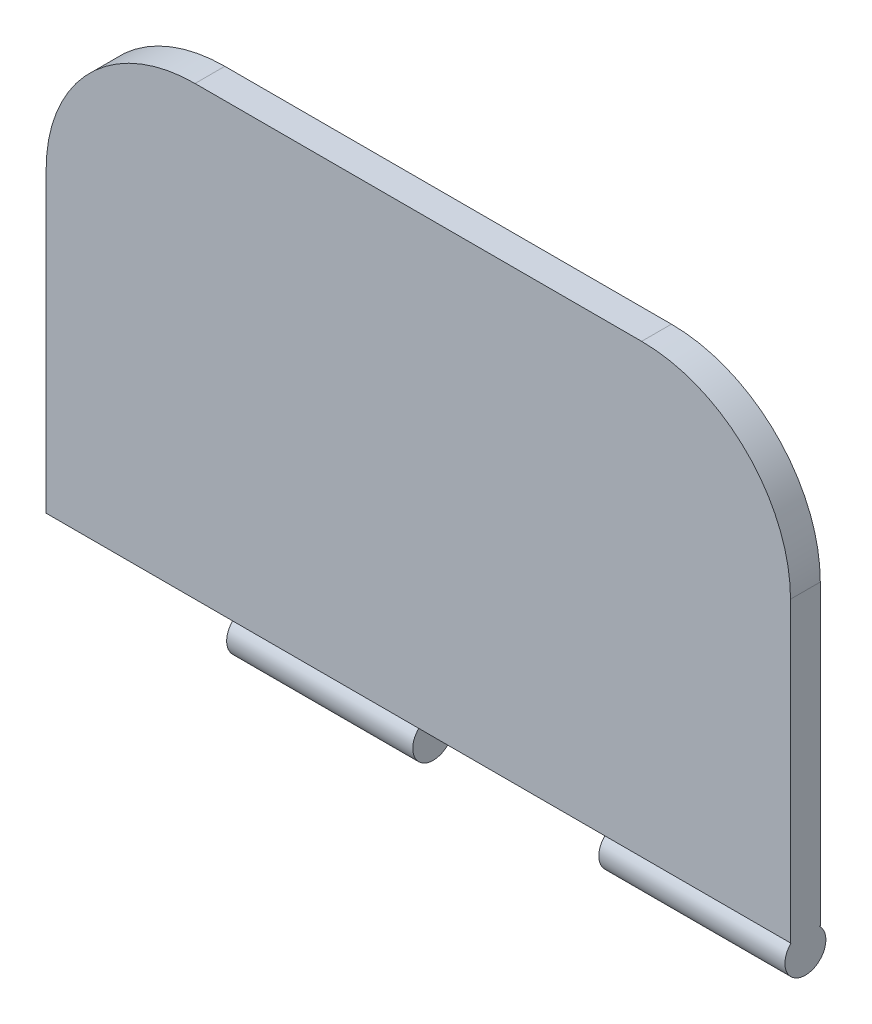
ISO-10303-21;
HEADER;
FILE_DESCRIPTION(('STEP AP214'),'2;1');
FILE_NAME('part.step','',(''),(''),'','','');
FILE_SCHEMA(('AUTOMOTIVE_DESIGN { 1 0 10303 214 1 1 1 1 }'));
ENDSEC;
DATA;
#1=APPLICATION_CONTEXT('core data for automotive mechanical design processes');
#2=APPLICATION_PROTOCOL_DEFINITION('international standard','automotive_design',2000,#1);
#3=PRODUCT_CONTEXT('',#1,'mechanical');
#4=PRODUCT('Part','Part','',(#3));
#5=PRODUCT_RELATED_PRODUCT_CATEGORY('part','',(#4));
#6=PRODUCT_DEFINITION_FORMATION('','',#4);
#7=PRODUCT_DEFINITION_CONTEXT('part definition',#1,'design');
#8=PRODUCT_DEFINITION('design','',#6,#7);
#9=PRODUCT_DEFINITION_SHAPE('','',#8);
#10=(LENGTH_UNIT() NAMED_UNIT(*) SI_UNIT(.MILLI.,.METRE.));
#11=(NAMED_UNIT(*) PLANE_ANGLE_UNIT() SI_UNIT($,.RADIAN.));
#12=(NAMED_UNIT(*) SI_UNIT($,.STERADIAN.) SOLID_ANGLE_UNIT());
#13=UNCERTAINTY_MEASURE_WITH_UNIT(LENGTH_MEASURE(1.E-05),#10,'distance_accuracy_value','');
#14=(GEOMETRIC_REPRESENTATION_CONTEXT(3) GLOBAL_UNCERTAINTY_ASSIGNED_CONTEXT((#13)) GLOBAL_UNIT_ASSIGNED_CONTEXT((#10,
#11,#12)) REPRESENTATION_CONTEXT('',''));
#15=CARTESIAN_POINT('',(0.,0.,0.));
#16=DIRECTION('',(0.,0.,1.));
#17=DIRECTION('',(1.,0.,0.));
#18=AXIS2_PLACEMENT_3D('',#15,#16,#17);
#19=CARTESIAN_POINT('',(-28.889087296526,-16.,1.));
#20=DIRECTION('',(1.,0.,0.));
#21=DIRECTION('',(0.,1.,0.));
#22=AXIS2_PLACEMENT_3D('',#19,#20,#21);
#23=CYLINDRICAL_SURFACE('',#22,1.375);
#24=CARTESIAN_POINT('',(0.,-16.,1.));
#25=DIRECTION('',(-1.,0.,0.));
#26=DIRECTION('',(0.,-1.,0.));
#27=AXIS2_PLACEMENT_3D('',#24,#25,#26);
#28=CIRCLE('',#27,1.375);
#29=CARTESIAN_POINT('',(0.,-15.,1.94372930440885));
#30=VERTEX_POINT('',#29);
#31=CARTESIAN_POINT('',(0.,-15.,0.0562706955911504));
#32=VERTEX_POINT('',#31);
#33=EDGE_CURVE('E126',#30,#32,#28,.T.);
#34=ORIENTED_EDGE('',*,*,#33,.T.);
#35=DIRECTION('',(1.,0.,0.));
#36=VECTOR('',#35,1.);
#37=CARTESIAN_POINT('',(-28.889087296526,-15.,0.0562706955911434));
#38=LINE('',#37,#36);
#39=CARTESIAN_POINT('',(12.5,-15.,0.0562706955911434));
#40=VERTEX_POINT('',#39);
#41=EDGE_CURVE('E199',#40,#32,#38,.F.);
#42=ORIENTED_EDGE('',*,*,#41,.F.);
#43=CARTESIAN_POINT('',(12.5,-16.,1.));
#44=DIRECTION('',(1.,0.,0.));
#45=DIRECTION('',(0.,1.,0.));
#46=AXIS2_PLACEMENT_3D('',#43,#44,#45);
#47=CIRCLE('',#46,1.375);
#48=CARTESIAN_POINT('',(12.5,-15.,1.94372930440886));
#49=VERTEX_POINT('',#48);
#50=EDGE_CURVE('E11',#49,#40,#47,.F.);
#51=ORIENTED_EDGE('',*,*,#50,.F.);
#52=DIRECTION('',(1.,0.,0.));
#53=VECTOR('',#52,1.);
#54=CARTESIAN_POINT('',(-28.889087296526,-15.,1.94372930440886));
#55=LINE('',#54,#53);
#56=EDGE_CURVE('E55',#30,#49,#55,.T.);
#57=ORIENTED_EDGE('',*,*,#56,.F.);
#58=EDGE_LOOP('',(#34,#42,#51,#57));
#59=FACE_BOUND('',#58,.T.);
#60=ADVANCED_FACE('F33',(#59),#23,.F.);
#61=CARTESIAN_POINT('',(-12.5,-15.,0.0562706955911434));
#62=VERTEX_POINT('',#61);
#63=CARTESIAN_POINT('',(-25.,-15.,0.0562706955911435));
#64=VERTEX_POINT('',#63);
#65=EDGE_CURVE('E196',#62,#64,#38,.F.);
#66=ORIENTED_EDGE('',*,*,#65,.F.);
#67=CARTESIAN_POINT('',(-12.5,-16.,1.));
#68=DIRECTION('',(-1.,0.,0.));
#69=DIRECTION('',(0.,-1.,0.));
#70=AXIS2_PLACEMENT_3D('',#67,#68,#69);
#71=CIRCLE('',#70,1.375);
#72=CARTESIAN_POINT('',(-12.5,-15.,1.94372930440885));
#73=VERTEX_POINT('',#72);
#74=EDGE_CURVE('E47',#73,#62,#71,.T.);
#75=ORIENTED_EDGE('',*,*,#74,.F.);
#76=CARTESIAN_POINT('',(-25.,-15.,1.94372930440886));
#77=VERTEX_POINT('',#76);
#78=EDGE_CURVE('E41',#77,#73,#55,.T.);
#79=ORIENTED_EDGE('',*,*,#78,.F.);
#80=CARTESIAN_POINT('',(-25.,-16.,1.));
#81=DIRECTION('',(1.,0.,0.));
#82=DIRECTION('',(0.,1.,0.));
#83=AXIS2_PLACEMENT_3D('',#80,#81,#82);
#84=CIRCLE('',#83,1.375);
#85=EDGE_CURVE('E146',#77,#64,#84,.F.);
#86=ORIENTED_EDGE('',*,*,#85,.T.);
#87=EDGE_LOOP('',(#66,#75,#79,#86));
#88=FACE_BOUND('',#87,.T.);
#89=ADVANCED_FACE('F221',(#88),#23,.F.);
#90=CARTESIAN_POINT('',(-25.,-15.,2.));
#91=DIRECTION('',(0.,1.,0.));
#92=DIRECTION('',(0.,0.,1.));
#93=AXIS2_PLACEMENT_3D('',#90,#91,#92);
#94=PLANE('',#93);
#95=DIRECTION('',(0.,0.,-1.));
#96=VECTOR('',#95,1.);
#97=CARTESIAN_POINT('',(-25.,-15.,2.));
#98=LINE('',#97,#96);
#99=CARTESIAN_POINT('',(-25.,-15.,2.));
#100=VERTEX_POINT('',#99);
#101=EDGE_CURVE('E182',#100,#77,#98,.T.);
#102=ORIENTED_EDGE('',*,*,#101,.T.);
#103=ORIENTED_EDGE('',*,*,#78,.T.);
#104=DIRECTION('',(1.,0.,0.));
#105=VECTOR('',#104,1.);
#106=CARTESIAN_POINT('',(-12.5,-15.,1.94372930440885));
#107=LINE('',#106,#105);
#108=EDGE_CURVE('E121',#30,#73,#107,.F.);
#109=ORIENTED_EDGE('',*,*,#108,.F.);
#110=ORIENTED_EDGE('',*,*,#56,.T.);
#111=CARTESIAN_POINT('',(25.,-15.,1.94372930440885));
#112=VERTEX_POINT('',#111);
#113=EDGE_CURVE('E134',#49,#112,#55,.T.);
#114=ORIENTED_EDGE('',*,*,#113,.T.);
#115=DIRECTION('',(0.,0.,-1.));
#116=VECTOR('',#115,1.);
#117=CARTESIAN_POINT('',(25.,-15.,2.));
#118=LINE('',#117,#116);
#119=CARTESIAN_POINT('',(25.,-15.,2.));
#120=VERTEX_POINT('',#119);
#121=EDGE_CURVE('E179',#120,#112,#118,.T.);
#122=ORIENTED_EDGE('',*,*,#121,.F.);
#123=DIRECTION('',(1.,0.,0.));
#124=VECTOR('',#123,1.);
#125=CARTESIAN_POINT('',(-25.,-15.,2.));
#126=LINE('',#125,#124);
#127=EDGE_CURVE('E163',#100,#120,#126,.T.);
#128=ORIENTED_EDGE('',*,*,#127,.F.);
#129=EDGE_LOOP('',(#102,#103,#109,#110,#114,#122,#128));
#130=FACE_BOUND('',#129,.T.);
#131=ADVANCED_FACE('F137',(#130),#94,.F.);
#132=CARTESIAN_POINT('',(25.,5.,2.));
#133=DIRECTION('',(-1.,0.,0.));
#134=DIRECTION('',(0.,-1.,0.));
#135=AXIS2_PLACEMENT_3D('',#132,#133,#134);
#136=PLANE('',#135);
#137=ORIENTED_EDGE('',*,*,#121,.T.);
#138=CARTESIAN_POINT('',(25.,-16.,1.));
#139=DIRECTION('',(1.,0.,0.));
#140=DIRECTION('',(0.,1.,0.));
#141=AXIS2_PLACEMENT_3D('',#138,#139,#140);
#142=CIRCLE('',#141,1.375);
#143=CARTESIAN_POINT('',(25.,-15.,0.0562706955911544));
#144=VERTEX_POINT('',#143);
#145=EDGE_CURVE('E138',#112,#144,#142,.T.);
#146=ORIENTED_EDGE('',*,*,#145,.T.);
#147=CARTESIAN_POINT('',(25.,-15.,0.));
#148=VERTEX_POINT('',#147);
#149=EDGE_CURVE('E165',#144,#148,#118,.T.);
#150=ORIENTED_EDGE('',*,*,#149,.T.);
#151=DIRECTION('',(0.,1.,0.));
#152=VECTOR('',#151,1.);
#153=CARTESIAN_POINT('',(25.,5.,0.));
#154=LINE('',#153,#152);
#155=CARTESIAN_POINT('',(25.,5.,0.));
#156=VERTEX_POINT('',#155);
#157=EDGE_CURVE('E150',#148,#156,#154,.T.);
#158=ORIENTED_EDGE('',*,*,#157,.T.);
#159=DIRECTION('',(0.,0.,-1.));
#160=VECTOR('',#159,1.);
#161=CARTESIAN_POINT('',(25.,5.,2.));
#162=LINE('',#161,#160);
#163=CARTESIAN_POINT('',(25.,5.,2.));
#164=VERTEX_POINT('',#163);
#165=EDGE_CURVE('E193',#164,#156,#162,.T.);
#166=ORIENTED_EDGE('',*,*,#165,.F.);
#167=DIRECTION('',(0.,1.,0.));
#168=VECTOR('',#167,1.);
#169=CARTESIAN_POINT('',(25.,5.,2.));
#170=LINE('',#169,#168);
#171=EDGE_CURVE('E151',#120,#164,#170,.T.);
#172=ORIENTED_EDGE('',*,*,#171,.F.);
#173=EDGE_LOOP('',(#137,#146,#150,#158,#166,#172));
#174=FACE_BOUND('',#173,.T.);
#175=ADVANCED_FACE('F35',(#174),#136,.F.);
#176=CARTESIAN_POINT('',(15.,5.,2.));
#177=DIRECTION('',(0.,0.,-1.));
#178=DIRECTION('',(-1.,0.,0.));
#179=AXIS2_PLACEMENT_3D('',#176,#177,#178);
#180=CYLINDRICAL_SURFACE('',#179,10.);
#181=CARTESIAN_POINT('',(15.,5.,0.));
#182=DIRECTION('',(0.,0.,1.));
#183=DIRECTION('',(1.,0.,0.));
#184=AXIS2_PLACEMENT_3D('',#181,#182,#183);
#185=CIRCLE('',#184,10.);
#186=CARTESIAN_POINT('',(15.,15.,0.));
#187=VERTEX_POINT('',#186);
#188=EDGE_CURVE('E168',#156,#187,#185,.T.);
#189=ORIENTED_EDGE('',*,*,#188,.T.);
#190=DIRECTION('',(0.,0.,-1.));
#191=VECTOR('',#190,1.);
#192=CARTESIAN_POINT('',(15.,15.,2.));
#193=LINE('',#192,#191);
#194=CARTESIAN_POINT('',(15.,15.,2.));
#195=VERTEX_POINT('',#194);
#196=EDGE_CURVE('E190',#195,#187,#193,.T.);
#197=ORIENTED_EDGE('',*,*,#196,.F.);
#198=CARTESIAN_POINT('',(15.,5.,2.));
#199=DIRECTION('',(0.,0.,1.));
#200=DIRECTION('',(1.,0.,0.));
#201=AXIS2_PLACEMENT_3D('',#198,#199,#200);
#202=CIRCLE('',#201,10.);
#203=EDGE_CURVE('E154',#164,#195,#202,.T.);
#204=ORIENTED_EDGE('',*,*,#203,.F.);
#205=ORIENTED_EDGE('',*,*,#165,.T.);
#206=EDGE_LOOP('',(#189,#197,#204,#205));
#207=FACE_BOUND('',#206,.T.);
#208=ADVANCED_FACE('F257',(#207),#180,.T.);
#209=CARTESIAN_POINT('',(-15.,15.,2.));
#210=DIRECTION('',(0.,-1.,0.));
#211=DIRECTION('',(0.,0.,-1.));
#212=AXIS2_PLACEMENT_3D('',#209,#210,#211);
#213=PLANE('',#212);
#214=DIRECTION('',(-1.,0.,0.));
#215=VECTOR('',#214,1.);
#216=CARTESIAN_POINT('',(-15.,15.,0.));
#217=LINE('',#216,#215);
#218=CARTESIAN_POINT('',(-15.,15.,0.));
#219=VERTEX_POINT('',#218);
#220=EDGE_CURVE('E170',#187,#219,#217,.T.);
#221=ORIENTED_EDGE('',*,*,#220,.T.);
#222=DIRECTION('',(0.,0.,-1.));
#223=VECTOR('',#222,1.);
#224=CARTESIAN_POINT('',(-15.,15.,2.));
#225=LINE('',#224,#223);
#226=CARTESIAN_POINT('',(-15.,15.,2.));
#227=VERTEX_POINT('',#226);
#228=EDGE_CURVE('E187',#227,#219,#225,.T.);
#229=ORIENTED_EDGE('',*,*,#228,.F.);
#230=DIRECTION('',(-1.,0.,0.));
#231=VECTOR('',#230,1.);
#232=CARTESIAN_POINT('',(-15.,15.,2.));
#233=LINE('',#232,#231);
#234=EDGE_CURVE('E157',#195,#227,#233,.T.);
#235=ORIENTED_EDGE('',*,*,#234,.F.);
#236=ORIENTED_EDGE('',*,*,#196,.T.);
#237=EDGE_LOOP('',(#221,#229,#235,#236));
#238=FACE_BOUND('',#237,.T.);
#239=ADVANCED_FACE('F254',(#238),#213,.F.);
#240=CARTESIAN_POINT('',(-15.,5.,2.));
#241=DIRECTION('',(0.,0.,-1.));
#242=DIRECTION('',(-1.,0.,0.));
#243=AXIS2_PLACEMENT_3D('',#240,#241,#242);
#244=CYLINDRICAL_SURFACE('',#243,10.);
#245=CARTESIAN_POINT('',(-15.,5.,0.));
#246=DIRECTION('',(0.,0.,1.));
#247=DIRECTION('',(1.,0.,0.));
#248=AXIS2_PLACEMENT_3D('',#245,#246,#247);
#249=CIRCLE('',#248,10.);
#250=CARTESIAN_POINT('',(-25.,5.,0.));
#251=VERTEX_POINT('',#250);
#252=EDGE_CURVE('E172',#219,#251,#249,.T.);
#253=ORIENTED_EDGE('',*,*,#252,.T.);
#254=DIRECTION('',(0.,0.,-1.));
#255=VECTOR('',#254,1.);
#256=CARTESIAN_POINT('',(-25.,5.,2.));
#257=LINE('',#256,#255);
#258=CARTESIAN_POINT('',(-25.,5.,2.));
#259=VERTEX_POINT('',#258);
#260=EDGE_CURVE('E184',#259,#251,#257,.T.);
#261=ORIENTED_EDGE('',*,*,#260,.F.);
#262=CARTESIAN_POINT('',(-15.,5.,2.));
#263=DIRECTION('',(0.,0.,1.));
#264=DIRECTION('',(1.,0.,0.));
#265=AXIS2_PLACEMENT_3D('',#262,#263,#264);
#266=CIRCLE('',#265,10.);
#267=EDGE_CURVE('E159',#227,#259,#266,.T.);
#268=ORIENTED_EDGE('',*,*,#267,.F.);
#269=ORIENTED_EDGE('',*,*,#228,.T.);
#270=EDGE_LOOP('',(#253,#261,#268,#269));
#271=FACE_BOUND('',#270,.T.);
#272=ADVANCED_FACE('F251',(#271),#244,.T.);
#273=CARTESIAN_POINT('',(-25.,5.,2.));
#274=DIRECTION('',(1.,0.,0.));
#275=DIRECTION('',(0.,1.,0.));
#276=AXIS2_PLACEMENT_3D('',#273,#274,#275);
#277=PLANE('',#276);
#278=CARTESIAN_POINT('',(-25.,-15.,0.));
#279=VERTEX_POINT('',#278);
#280=EDGE_CURVE('E181',#64,#279,#98,.T.);
#281=ORIENTED_EDGE('',*,*,#280,.F.);
#282=ORIENTED_EDGE('',*,*,#85,.F.);
#283=ORIENTED_EDGE('',*,*,#101,.F.);
#284=DIRECTION('',(0.,-1.,0.));
#285=VECTOR('',#284,1.);
#286=CARTESIAN_POINT('',(-25.,5.,2.));
#287=LINE('',#286,#285);
#288=EDGE_CURVE('E161',#259,#100,#287,.T.);
#289=ORIENTED_EDGE('',*,*,#288,.F.);
#290=ORIENTED_EDGE('',*,*,#260,.T.);
#291=DIRECTION('',(0.,-1.,0.));
#292=VECTOR('',#291,1.);
#293=CARTESIAN_POINT('',(-25.,5.,0.));
#294=LINE('',#293,#292);
#295=EDGE_CURVE('E174',#251,#279,#294,.T.);
#296=ORIENTED_EDGE('',*,*,#295,.T.);
#297=EDGE_LOOP('',(#281,#282,#283,#289,#290,#296));
#298=FACE_BOUND('',#297,.T.);
#299=ADVANCED_FACE('F218',(#298),#277,.F.);
#300=ORIENTED_EDGE('',*,*,#149,.F.);
#301=EDGE_CURVE('E197',#144,#40,#38,.F.);
#302=ORIENTED_EDGE('',*,*,#301,.T.);
#303=ORIENTED_EDGE('',*,*,#41,.T.);
#304=EDGE_CURVE('E123',#32,#62,#38,.F.);
#305=ORIENTED_EDGE('',*,*,#304,.T.);
#306=ORIENTED_EDGE('',*,*,#65,.T.);
#307=ORIENTED_EDGE('',*,*,#280,.T.);
#308=DIRECTION('',(1.,0.,0.));
#309=VECTOR('',#308,1.);
#310=CARTESIAN_POINT('',(-25.,-15.,0.));
#311=LINE('',#310,#309);
#312=EDGE_CURVE('E155',#279,#148,#311,.T.);
#313=ORIENTED_EDGE('',*,*,#312,.T.);
#314=EDGE_LOOP('',(#300,#302,#303,#305,#306,#307,#313));
#315=FACE_BOUND('',#314,.T.);
#316=ADVANCED_FACE('F223',(#315),#94,.F.);
#317=CARTESIAN_POINT('',(-15.,5.,2.));
#318=DIRECTION('',(0.,0.,1.));
#319=DIRECTION('',(1.,0.,0.));
#320=AXIS2_PLACEMENT_3D('',#317,#318,#319);
#321=PLANE('',#320);
#322=ORIENTED_EDGE('',*,*,#171,.T.);
#323=ORIENTED_EDGE('',*,*,#203,.T.);
#324=ORIENTED_EDGE('',*,*,#234,.T.);
#325=ORIENTED_EDGE('',*,*,#267,.T.);
#326=ORIENTED_EDGE('',*,*,#288,.T.);
#327=ORIENTED_EDGE('',*,*,#127,.T.);
#328=EDGE_LOOP('',(#322,#323,#324,#325,#326,#327));
#329=FACE_BOUND('',#328,.T.);
#330=ADVANCED_FACE('F211',(#329),#321,.T.);
#331=CARTESIAN_POINT('',(-15.,5.,0.));
#332=DIRECTION('',(0.,0.,1.));
#333=DIRECTION('',(1.,0.,0.));
#334=AXIS2_PLACEMENT_3D('',#331,#332,#333);
#335=PLANE('',#334);
#336=CARTESIAN_POINT('',(0.,0.,0.));
#337=DIRECTION('',(0.,0.,-1.));
#338=DIRECTION('',(-1.,0.,0.));
#339=AXIS2_PLACEMENT_3D('',#336,#337,#338);
#340=CIRCLE('',#339,3.5);
#341=CARTESIAN_POINT('',(-3.5,0.,0.));
#342=VERTEX_POINT('',#341);
#343=EDGE_CURVE('E392',#342,#342,#340,.T.);
#344=ORIENTED_EDGE('',*,*,#343,.F.);
#345=EDGE_LOOP('',(#344));
#346=FACE_BOUND('',#345,.T.);
#347=ORIENTED_EDGE('',*,*,#157,.F.);
#348=ORIENTED_EDGE('',*,*,#312,.F.);
#349=ORIENTED_EDGE('',*,*,#295,.F.);
#350=ORIENTED_EDGE('',*,*,#252,.F.);
#351=ORIENTED_EDGE('',*,*,#220,.F.);
#352=ORIENTED_EDGE('',*,*,#188,.F.);
#353=EDGE_LOOP('',(#347,#348,#349,#350,#351,#352));
#354=FACE_BOUND('',#353,.T.);
#355=ADVANCED_FACE('F234',(#346,#354),#335,.F.);
#356=CARTESIAN_POINT('',(12.5,-16.,1.));
#357=DIRECTION('',(1.,0.,0.));
#358=DIRECTION('',(0.,1.,0.));
#359=AXIS2_PLACEMENT_3D('',#356,#357,#358);
#360=CYLINDRICAL_SURFACE('',#359,1.375);
#361=ORIENTED_EDGE('',*,*,#113,.F.);
#362=CARTESIAN_POINT('',(12.5,-16.,1.));
#363=DIRECTION('',(1.,0.,0.));
#364=DIRECTION('',(0.,1.,0.));
#365=AXIS2_PLACEMENT_3D('',#362,#363,#364);
#366=CIRCLE('',#365,1.375);
#367=EDGE_CURVE('E141',#49,#40,#366,.T.);
#368=ORIENTED_EDGE('',*,*,#367,.T.);
#369=ORIENTED_EDGE('',*,*,#301,.F.);
#370=ORIENTED_EDGE('',*,*,#145,.F.);
#371=EDGE_LOOP('',(#361,#368,#369,#370));
#372=FACE_BOUND('',#371,.T.);
#373=ADVANCED_FACE('F207',(#372),#360,.T.);
#374=CARTESIAN_POINT('',(12.5,-16.,1.));
#375=DIRECTION('',(1.,0.,0.));
#376=DIRECTION('',(0.,1.,0.));
#377=AXIS2_PLACEMENT_3D('',#374,#375,#376);
#378=PLANE('',#377);
#379=ORIENTED_EDGE('',*,*,#367,.F.);
#380=ORIENTED_EDGE('',*,*,#50,.T.);
#381=EDGE_LOOP('',(#379,#380));
#382=FACE_BOUND('',#381,.T.);
#383=ADVANCED_FACE('F225',(#382),#378,.F.);
#384=CARTESIAN_POINT('',(-12.5,-16.,1.));
#385=DIRECTION('',(1.,0.,0.));
#386=DIRECTION('',(0.,1.,0.));
#387=AXIS2_PLACEMENT_3D('',#384,#385,#386);
#388=CYLINDRICAL_SURFACE('',#387,1.375);
#389=EDGE_CURVE('E118',#32,#30,#28,.T.);
#390=ORIENTED_EDGE('',*,*,#389,.T.);
#391=ORIENTED_EDGE('',*,*,#108,.T.);
#392=EDGE_CURVE('E132',#62,#73,#71,.T.);
#393=ORIENTED_EDGE('',*,*,#392,.F.);
#394=ORIENTED_EDGE('',*,*,#304,.F.);
#395=EDGE_LOOP('',(#390,#391,#393,#394));
#396=FACE_BOUND('',#395,.T.);
#397=ADVANCED_FACE('F120',(#396),#388,.T.);
#398=CARTESIAN_POINT('',(-12.5,-16.,1.));
#399=DIRECTION('',(-1.,0.,0.));
#400=DIRECTION('',(0.,-1.,0.));
#401=AXIS2_PLACEMENT_3D('',#398,#399,#400);
#402=PLANE('',#401);
#403=ORIENTED_EDGE('',*,*,#74,.T.);
#404=ORIENTED_EDGE('',*,*,#392,.T.);
#405=EDGE_LOOP('',(#403,#404));
#406=FACE_BOUND('',#405,.T.);
#407=ADVANCED_FACE('F232',(#406),#402,.T.);
#408=CARTESIAN_POINT('',(0.,-16.,1.));
#409=DIRECTION('',(-1.,0.,0.));
#410=DIRECTION('',(0.,-1.,0.));
#411=AXIS2_PLACEMENT_3D('',#408,#409,#410);
#412=PLANE('',#411);
#413=ORIENTED_EDGE('',*,*,#33,.F.);
#414=ORIENTED_EDGE('',*,*,#389,.F.);
#415=EDGE_LOOP('',(#413,#414));
#416=FACE_BOUND('',#415,.T.);
#417=ADVANCED_FACE('F129',(#416),#412,.F.);
#418=CARTESIAN_POINT('',(0.,0.,1.));
#419=DIRECTION('',(0.,0.,-1.));
#420=DIRECTION('',(-1.,0.,0.));
#421=AXIS2_PLACEMENT_3D('',#418,#419,#420);
#422=CYLINDRICAL_SURFACE('',#421,3.5);
#423=CARTESIAN_POINT('',(0.,0.,1.));
#424=DIRECTION('',(0.,0.,-1.));
#425=DIRECTION('',(-1.,0.,0.));
#426=AXIS2_PLACEMENT_3D('',#423,#424,#425);
#427=CIRCLE('',#426,3.5);
#428=CARTESIAN_POINT('',(-3.5,0.,1.));
#429=VERTEX_POINT('',#428);
#430=EDGE_CURVE('E127',#429,#429,#427,.T.);
#431=ORIENTED_EDGE('',*,*,#430,.F.);
#432=EDGE_LOOP('',(#431));
#433=FACE_BOUND('',#432,.T.);
#434=ORIENTED_EDGE('',*,*,#343,.T.);
#435=EDGE_LOOP('',(#434));
#436=FACE_BOUND('',#435,.T.);
#437=ADVANCED_FACE('F352',(#433,#436),#422,.F.);
#438=CARTESIAN_POINT('',(0.,0.,1.));
#439=DIRECTION('',(0.,0.,-1.));
#440=DIRECTION('',(-1.,0.,0.));
#441=AXIS2_PLACEMENT_3D('',#438,#439,#440);
#442=PLANE('',#441);
#443=ORIENTED_EDGE('',*,*,#430,.T.);
#444=EDGE_LOOP('',(#443));
#445=FACE_BOUND('',#444,.T.);
#446=ADVANCED_FACE('F357',(#445),#442,.T.);
#447=CLOSED_SHELL('',(#60,#89,#131,#175,#208,#239,#272,#299,#316,#330,#355,#373,#383,#397,#407,
#417,#437,#446));
#448=MANIFOLD_SOLID_BREP('B2',#447);
#449=ADVANCED_BREP_SHAPE_REPRESENTATION('',(#18,#448),#14);
#450=SHAPE_DEFINITION_REPRESENTATION(#9,#449);
ENDSEC;
END-ISO-10303-21;
